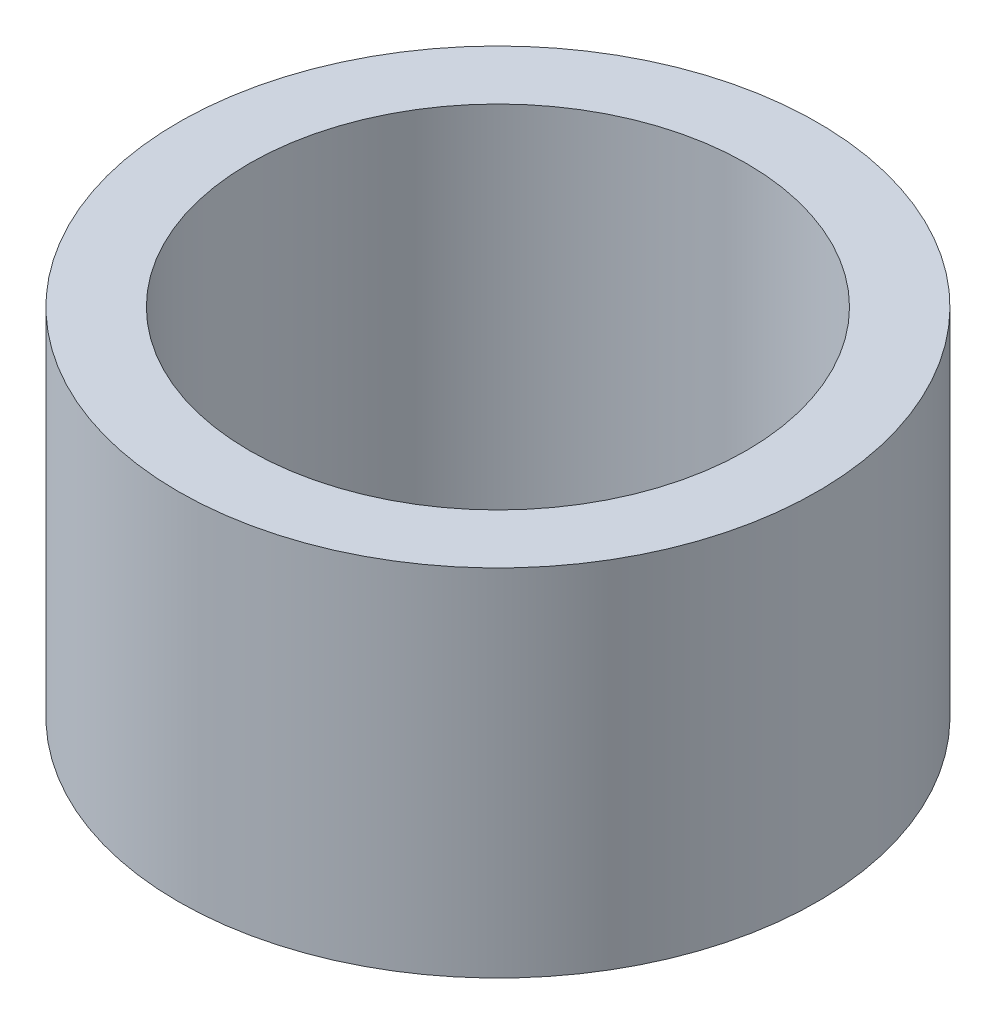
ISO-10303-21;
HEADER;
FILE_DESCRIPTION(('STEP AP214'),'2;1');
FILE_NAME('part.step','',(''),(''),'','','');
FILE_SCHEMA(('AUTOMOTIVE_DESIGN { 1 0 10303 214 1 1 1 1 }'));
ENDSEC;
DATA;
#1=APPLICATION_CONTEXT('core data for automotive mechanical design processes');
#2=APPLICATION_PROTOCOL_DEFINITION('international standard','automotive_design',2000,#1);
#3=PRODUCT_CONTEXT('',#1,'mechanical');
#4=PRODUCT('Part','Part','',(#3));
#5=PRODUCT_RELATED_PRODUCT_CATEGORY('part','',(#4));
#6=PRODUCT_DEFINITION_FORMATION('','',#4);
#7=PRODUCT_DEFINITION_CONTEXT('part definition',#1,'design');
#8=PRODUCT_DEFINITION('design','',#6,#7);
#9=PRODUCT_DEFINITION_SHAPE('','',#8);
#10=(LENGTH_UNIT() NAMED_UNIT(*) SI_UNIT(.MILLI.,.METRE.));
#11=(NAMED_UNIT(*) PLANE_ANGLE_UNIT() SI_UNIT($,.RADIAN.));
#12=(NAMED_UNIT(*) SI_UNIT($,.STERADIAN.) SOLID_ANGLE_UNIT());
#13=UNCERTAINTY_MEASURE_WITH_UNIT(LENGTH_MEASURE(1.E-05),#10,'distance_accuracy_value','');
#14=(GEOMETRIC_REPRESENTATION_CONTEXT(3) GLOBAL_UNCERTAINTY_ASSIGNED_CONTEXT((#13)) GLOBAL_UNIT_ASSIGNED_CONTEXT((#10,
#11,#12)) REPRESENTATION_CONTEXT('',''));
#15=CARTESIAN_POINT('',(0.,0.,0.));
#16=DIRECTION('',(0.,0.,1.));
#17=DIRECTION('',(1.,0.,0.));
#18=AXIS2_PLACEMENT_3D('',#15,#16,#17);
#19=CARTESIAN_POINT('',(0.,25.,0.));
#20=DIRECTION('',(0.,1.,0.));
#21=DIRECTION('',(0.,0.,1.));
#22=AXIS2_PLACEMENT_3D('',#19,#20,#21);
#23=PLANE('',#22);
#24=CARTESIAN_POINT('',(0.,25.,0.));
#25=DIRECTION('',(0.,1.,0.));
#26=DIRECTION('',(0.,0.,1.));
#27=AXIS2_PLACEMENT_3D('',#24,#25,#26);
#28=CIRCLE('',#27,22.5);
#29=CARTESIAN_POINT('',(0.,25.,22.5));
#30=VERTEX_POINT('',#29);
#31=EDGE_CURVE('E10',#30,#30,#28,.T.);
#32=ORIENTED_EDGE('',*,*,#31,.T.);
#33=EDGE_LOOP('',(#32));
#34=FACE_BOUND('',#33,.T.);
#35=CARTESIAN_POINT('',(0.,25.,0.));
#36=DIRECTION('',(0.,1.,0.));
#37=DIRECTION('',(0.,0.,1.));
#38=AXIS2_PLACEMENT_3D('',#35,#36,#37);
#39=CIRCLE('',#38,17.5);
#40=CARTESIAN_POINT('',(0.,25.,17.5));
#41=VERTEX_POINT('',#40);
#42=EDGE_CURVE('E42',#41,#41,#39,.T.);
#43=ORIENTED_EDGE('',*,*,#42,.F.);
#44=EDGE_LOOP('',(#43));
#45=FACE_BOUND('',#44,.T.);
#46=ADVANCED_FACE('F31',(#34,#45),#23,.T.);
#47=CARTESIAN_POINT('',(0.,0.,0.));
#48=DIRECTION('',(0.,1.,0.));
#49=DIRECTION('',(0.,0.,1.));
#50=AXIS2_PLACEMENT_3D('',#47,#48,#49);
#51=PLANE('',#50);
#52=CARTESIAN_POINT('',(0.,0.,0.));
#53=DIRECTION('',(0.,1.,0.));
#54=DIRECTION('',(0.,0.,1.));
#55=AXIS2_PLACEMENT_3D('',#52,#53,#54);
#56=CIRCLE('',#55,22.5);
#57=CARTESIAN_POINT('',(0.,0.,22.5));
#58=VERTEX_POINT('',#57);
#59=EDGE_CURVE('E35',#58,#58,#56,.T.);
#60=ORIENTED_EDGE('',*,*,#59,.F.);
#61=EDGE_LOOP('',(#60));
#62=FACE_BOUND('',#61,.T.);
#63=CARTESIAN_POINT('',(0.,0.,0.));
#64=DIRECTION('',(0.,1.,0.));
#65=DIRECTION('',(0.,0.,1.));
#66=AXIS2_PLACEMENT_3D('',#63,#64,#65);
#67=CIRCLE('',#66,17.5);
#68=CARTESIAN_POINT('',(0.,0.,17.5));
#69=VERTEX_POINT('',#68);
#70=EDGE_CURVE('E44',#69,#69,#67,.T.);
#71=ORIENTED_EDGE('',*,*,#70,.T.);
#72=EDGE_LOOP('',(#71));
#73=FACE_BOUND('',#72,.T.);
#74=ADVANCED_FACE('F54',(#62,#73),#51,.F.);
#75=CARTESIAN_POINT('',(0.,25.,0.));
#76=DIRECTION('',(0.,-1.,0.));
#77=DIRECTION('',(0.,0.,-1.));
#78=AXIS2_PLACEMENT_3D('',#75,#76,#77);
#79=CYLINDRICAL_SURFACE('',#78,22.5);
#80=ORIENTED_EDGE('',*,*,#31,.F.);
#81=EDGE_LOOP('',(#80));
#82=FACE_BOUND('',#81,.T.);
#83=ORIENTED_EDGE('',*,*,#59,.T.);
#84=EDGE_LOOP('',(#83));
#85=FACE_BOUND('',#84,.T.);
#86=ADVANCED_FACE('F33',(#82,#85),#79,.T.);
#87=CARTESIAN_POINT('',(0.,25.,0.));
#88=DIRECTION('',(0.,-1.,0.));
#89=DIRECTION('',(0.,0.,-1.));
#90=AXIS2_PLACEMENT_3D('',#87,#88,#89);
#91=CYLINDRICAL_SURFACE('',#90,17.5);
#92=ORIENTED_EDGE('',*,*,#42,.T.);
#93=EDGE_LOOP('',(#92));
#94=FACE_BOUND('',#93,.T.);
#95=ORIENTED_EDGE('',*,*,#70,.F.);
#96=EDGE_LOOP('',(#95));
#97=FACE_BOUND('',#96,.T.);
#98=ADVANCED_FACE('F50',(#94,#97),#91,.F.);
#99=CLOSED_SHELL('',(#46,#74,#86,#98));
#100=MANIFOLD_SOLID_BREP('B2',#99);
#101=ADVANCED_BREP_SHAPE_REPRESENTATION('',(#18,#100),#14);
#102=SHAPE_DEFINITION_REPRESENTATION(#9,#101);
ENDSEC;
END-ISO-10303-21;
